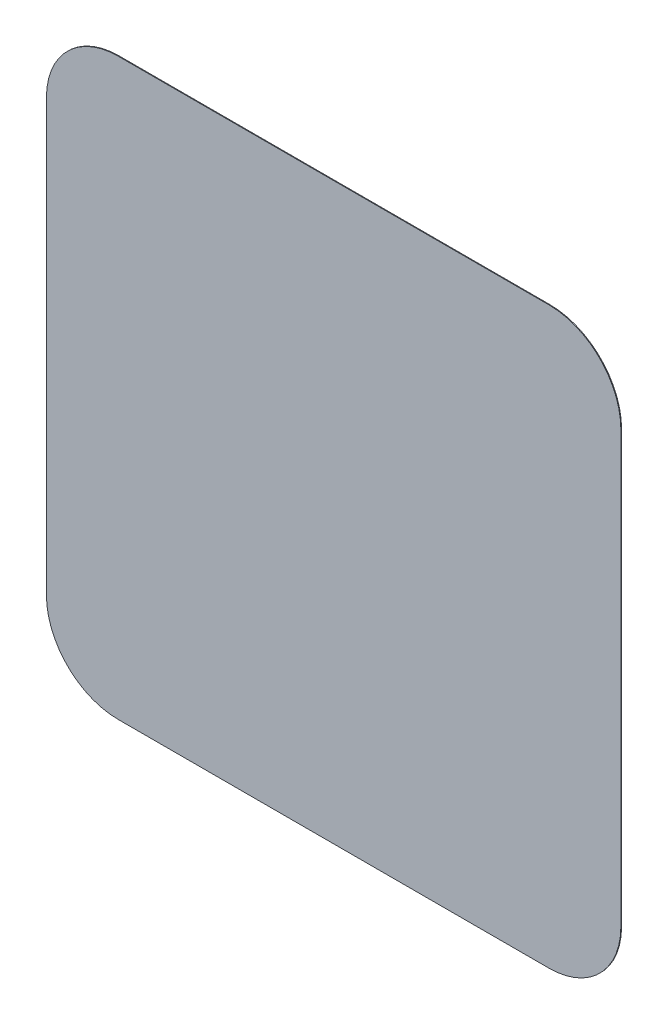
ISO-10303-21;
HEADER;
FILE_DESCRIPTION(('STEP AP214'),'2;1');
FILE_NAME('part.step','',(''),(''),'','','');
FILE_SCHEMA(('AUTOMOTIVE_DESIGN { 1 0 10303 214 1 1 1 1 }'));
ENDSEC;
DATA;
#1=APPLICATION_CONTEXT('core data for automotive mechanical design processes');
#2=APPLICATION_PROTOCOL_DEFINITION('international standard','automotive_design',2000,#1);
#3=PRODUCT_CONTEXT('',#1,'mechanical');
#4=PRODUCT('Part','Part','',(#3));
#5=PRODUCT_RELATED_PRODUCT_CATEGORY('part','',(#4));
#6=PRODUCT_DEFINITION_FORMATION('','',#4);
#7=PRODUCT_DEFINITION_CONTEXT('part definition',#1,'design');
#8=PRODUCT_DEFINITION('design','',#6,#7);
#9=PRODUCT_DEFINITION_SHAPE('','',#8);
#10=(LENGTH_UNIT() NAMED_UNIT(*) SI_UNIT(.MILLI.,.METRE.));
#11=(NAMED_UNIT(*) PLANE_ANGLE_UNIT() SI_UNIT($,.RADIAN.));
#12=(NAMED_UNIT(*) SI_UNIT($,.STERADIAN.) SOLID_ANGLE_UNIT());
#13=UNCERTAINTY_MEASURE_WITH_UNIT(LENGTH_MEASURE(1.E-05),#10,'distance_accuracy_value','');
#14=(GEOMETRIC_REPRESENTATION_CONTEXT(3) GLOBAL_UNCERTAINTY_ASSIGNED_CONTEXT((#13)) GLOBAL_UNIT_ASSIGNED_CONTEXT((#10,
#11,#12)) REPRESENTATION_CONTEXT('',''));
#15=CARTESIAN_POINT('',(0.,0.,0.));
#16=DIRECTION('',(0.,0.,1.));
#17=DIRECTION('',(1.,0.,0.));
#18=AXIS2_PLACEMENT_3D('',#15,#16,#17);
#19=CARTESIAN_POINT('',(-4.,-4.,0.01));
#20=DIRECTION('',(1.,0.,0.));
#21=DIRECTION('',(0.,0.,-1.));
#22=AXIS2_PLACEMENT_3D('',#19,#20,#21);
#23=PLANE('',#22);
#24=DIRECTION('',(0.,-1.,0.));
#25=VECTOR('',#24,1.);
#26=CARTESIAN_POINT('',(-4.,-4.,0.01));
#27=LINE('',#26,#25);
#28=CARTESIAN_POINT('',(-4.,3.,0.01));
#29=VERTEX_POINT('',#28);
#30=CARTESIAN_POINT('',(-4.,-3.,0.01));
#31=VERTEX_POINT('',#30);
#32=EDGE_CURVE('E127',#29,#31,#27,.T.);
#33=ORIENTED_EDGE('',*,*,#32,.F.);
#34=DIRECTION('',(0.,0.,-1.));
#35=VECTOR('',#34,1.);
#36=CARTESIAN_POINT('',(-4.,3.,0.01));
#37=LINE('',#36,#35);
#38=CARTESIAN_POINT('',(-4.,3.,0.));
#39=VERTEX_POINT('',#38);
#40=EDGE_CURVE('E158',#29,#39,#37,.T.);
#41=ORIENTED_EDGE('',*,*,#40,.T.);
#42=DIRECTION('',(0.,-1.,0.));
#43=VECTOR('',#42,1.);
#44=CARTESIAN_POINT('',(-4.,-4.,0.));
#45=LINE('',#44,#43);
#46=CARTESIAN_POINT('',(-4.,-3.,0.));
#47=VERTEX_POINT('',#46);
#48=EDGE_CURVE('E166',#39,#47,#45,.T.);
#49=ORIENTED_EDGE('',*,*,#48,.T.);
#50=DIRECTION('',(0.,0.,-1.));
#51=VECTOR('',#50,1.);
#52=CARTESIAN_POINT('',(-4.,-3.,0.01));
#53=LINE('',#52,#51);
#54=EDGE_CURVE('E156',#47,#31,#53,.F.);
#55=ORIENTED_EDGE('',*,*,#54,.T.);
#56=EDGE_LOOP('',(#33,#41,#49,#55));
#57=FACE_BOUND('',#56,.T.);
#58=ADVANCED_FACE('F37',(#57),#23,.F.);
#59=CARTESIAN_POINT('',(-4.,-4.,0.01));
#60=DIRECTION('',(0.,1.,0.));
#61=DIRECTION('',(0.,0.,1.));
#62=AXIS2_PLACEMENT_3D('',#59,#60,#61);
#63=PLANE('',#62);
#64=DIRECTION('',(1.,0.,0.));
#65=VECTOR('',#64,1.);
#66=CARTESIAN_POINT('',(-4.,-4.,0.));
#67=LINE('',#66,#65);
#68=CARTESIAN_POINT('',(-3.,-4.,0.));
#69=VERTEX_POINT('',#68);
#70=CARTESIAN_POINT('',(3.,-4.,0.));
#71=VERTEX_POINT('',#70);
#72=EDGE_CURVE('E132',#69,#71,#67,.T.);
#73=ORIENTED_EDGE('',*,*,#72,.T.);
#74=DIRECTION('',(0.,0.,-1.));
#75=VECTOR('',#74,1.);
#76=CARTESIAN_POINT('',(3.,-4.,0.01));
#77=LINE('',#76,#75);
#78=CARTESIAN_POINT('',(3.,-4.,0.01));
#79=VERTEX_POINT('',#78);
#80=EDGE_CURVE('E11',#71,#79,#77,.F.);
#81=ORIENTED_EDGE('',*,*,#80,.T.);
#82=DIRECTION('',(1.,0.,0.));
#83=VECTOR('',#82,1.);
#84=CARTESIAN_POINT('',(-4.,-4.,0.01));
#85=LINE('',#84,#83);
#86=CARTESIAN_POINT('',(-3.,-4.,0.01));
#87=VERTEX_POINT('',#86);
#88=EDGE_CURVE('E130',#87,#79,#85,.T.);
#89=ORIENTED_EDGE('',*,*,#88,.F.);
#90=DIRECTION('',(0.,0.,-1.));
#91=VECTOR('',#90,1.);
#92=CARTESIAN_POINT('',(-3.,-4.,0.01));
#93=LINE('',#92,#91);
#94=EDGE_CURVE('E44',#87,#69,#93,.T.);
#95=ORIENTED_EDGE('',*,*,#94,.T.);
#96=EDGE_LOOP('',(#73,#81,#89,#95));
#97=FACE_BOUND('',#96,.T.);
#98=ADVANCED_FACE('F163',(#97),#63,.F.);
#99=CARTESIAN_POINT('',(4.,-4.,0.01));
#100=DIRECTION('',(-1.,0.,0.));
#101=DIRECTION('',(0.,0.,1.));
#102=AXIS2_PLACEMENT_3D('',#99,#100,#101);
#103=PLANE('',#102);
#104=DIRECTION('',(0.,1.,0.));
#105=VECTOR('',#104,1.);
#106=CARTESIAN_POINT('',(4.,-4.,0.));
#107=LINE('',#106,#105);
#108=CARTESIAN_POINT('',(4.,-3.,0.));
#109=VERTEX_POINT('',#108);
#110=CARTESIAN_POINT('',(4.,3.,0.));
#111=VERTEX_POINT('',#110);
#112=EDGE_CURVE('E128',#109,#111,#107,.T.);
#113=ORIENTED_EDGE('',*,*,#112,.T.);
#114=DIRECTION('',(0.,0.,-1.));
#115=VECTOR('',#114,1.);
#116=CARTESIAN_POINT('',(4.,3.,0.01));
#117=LINE('',#116,#115);
#118=CARTESIAN_POINT('',(4.,3.,0.01));
#119=VERTEX_POINT('',#118);
#120=EDGE_CURVE('E106',#111,#119,#117,.F.);
#121=ORIENTED_EDGE('',*,*,#120,.T.);
#122=DIRECTION('',(0.,1.,0.));
#123=VECTOR('',#122,1.);
#124=CARTESIAN_POINT('',(4.,-4.,0.01));
#125=LINE('',#124,#123);
#126=CARTESIAN_POINT('',(4.,-3.,0.01));
#127=VERTEX_POINT('',#126);
#128=EDGE_CURVE('E137',#127,#119,#125,.T.);
#129=ORIENTED_EDGE('',*,*,#128,.F.);
#130=DIRECTION('',(0.,0.,-1.));
#131=VECTOR('',#130,1.);
#132=CARTESIAN_POINT('',(4.,-3.,0.01));
#133=LINE('',#132,#131);
#134=EDGE_CURVE('E111',#127,#109,#133,.T.);
#135=ORIENTED_EDGE('',*,*,#134,.T.);
#136=EDGE_LOOP('',(#113,#121,#129,#135));
#137=FACE_BOUND('',#136,.T.);
#138=ADVANCED_FACE('F186',(#137),#103,.F.);
#139=CARTESIAN_POINT('',(-4.,4.,0.01));
#140=DIRECTION('',(0.,-1.,0.));
#141=DIRECTION('',(0.,0.,-1.));
#142=AXIS2_PLACEMENT_3D('',#139,#140,#141);
#143=PLANE('',#142);
#144=DIRECTION('',(-1.,0.,0.));
#145=VECTOR('',#144,1.);
#146=CARTESIAN_POINT('',(-4.,4.,0.01));
#147=LINE('',#146,#145);
#148=CARTESIAN_POINT('',(3.,4.,0.01));
#149=VERTEX_POINT('',#148);
#150=CARTESIAN_POINT('',(-3.,4.,0.01));
#151=VERTEX_POINT('',#150);
#152=EDGE_CURVE('E121',#149,#151,#147,.T.);
#153=ORIENTED_EDGE('',*,*,#152,.F.);
#154=DIRECTION('',(0.,0.,-1.));
#155=VECTOR('',#154,1.);
#156=CARTESIAN_POINT('',(3.,4.,0.01));
#157=LINE('',#156,#155);
#158=CARTESIAN_POINT('',(3.,4.,0.));
#159=VERTEX_POINT('',#158);
#160=EDGE_CURVE('E105',#149,#159,#157,.T.);
#161=ORIENTED_EDGE('',*,*,#160,.T.);
#162=DIRECTION('',(-1.,0.,0.));
#163=VECTOR('',#162,1.);
#164=CARTESIAN_POINT('',(-4.,4.,0.));
#165=LINE('',#164,#163);
#166=CARTESIAN_POINT('',(-3.,4.,0.));
#167=VERTEX_POINT('',#166);
#168=EDGE_CURVE('E118',#159,#167,#165,.T.);
#169=ORIENTED_EDGE('',*,*,#168,.T.);
#170=DIRECTION('',(0.,0.,-1.));
#171=VECTOR('',#170,1.);
#172=CARTESIAN_POINT('',(-3.,4.,0.01));
#173=LINE('',#172,#171);
#174=EDGE_CURVE('E123',#167,#151,#173,.F.);
#175=ORIENTED_EDGE('',*,*,#174,.T.);
#176=EDGE_LOOP('',(#153,#161,#169,#175));
#177=FACE_BOUND('',#176,.T.);
#178=ADVANCED_FACE('F117',(#177),#143,.F.);
#179=CARTESIAN_POINT('',(-4.,4.,0.01));
#180=DIRECTION('',(0.,0.,-1.));
#181=DIRECTION('',(-1.,0.,0.));
#182=AXIS2_PLACEMENT_3D('',#179,#180,#181);
#183=PLANE('',#182);
#184=ORIENTED_EDGE('',*,*,#128,.T.);
#185=CARTESIAN_POINT('',(3.,3.,0.01));
#186=DIRECTION('',(0.,0.,-1.));
#187=DIRECTION('',(-1.,0.,0.));
#188=AXIS2_PLACEMENT_3D('',#185,#186,#187);
#189=CIRCLE('',#188,1.);
#190=EDGE_CURVE('E154',#119,#149,#189,.F.);
#191=ORIENTED_EDGE('',*,*,#190,.T.);
#192=ORIENTED_EDGE('',*,*,#152,.T.);
#193=CARTESIAN_POINT('',(-3.,3.,0.01));
#194=DIRECTION('',(0.,0.,-1.));
#195=DIRECTION('',(-1.,0.,0.));
#196=AXIS2_PLACEMENT_3D('',#193,#194,#195);
#197=CIRCLE('',#196,1.);
#198=EDGE_CURVE('E152',#151,#29,#197,.F.);
#199=ORIENTED_EDGE('',*,*,#198,.T.);
#200=ORIENTED_EDGE('',*,*,#32,.T.);
#201=CARTESIAN_POINT('',(-3.,-3.,0.01));
#202=DIRECTION('',(0.,0.,-1.));
#203=DIRECTION('',(-1.,0.,0.));
#204=AXIS2_PLACEMENT_3D('',#201,#202,#203);
#205=CIRCLE('',#204,1.);
#206=EDGE_CURVE('E56',#31,#87,#205,.F.);
#207=ORIENTED_EDGE('',*,*,#206,.T.);
#208=ORIENTED_EDGE('',*,*,#88,.T.);
#209=CARTESIAN_POINT('',(3.,-3.,0.01));
#210=DIRECTION('',(0.,0.,-1.));
#211=DIRECTION('',(-1.,0.,0.));
#212=AXIS2_PLACEMENT_3D('',#209,#210,#211);
#213=CIRCLE('',#212,1.);
#214=EDGE_CURVE('E150',#79,#127,#213,.F.);
#215=ORIENTED_EDGE('',*,*,#214,.T.);
#216=EDGE_LOOP('',(#184,#191,#192,#199,#200,#207,#208,#215));
#217=FACE_BOUND('',#216,.T.);
#218=ADVANCED_FACE('F195',(#217),#183,.F.);
#219=CARTESIAN_POINT('',(-4.,4.,0.));
#220=DIRECTION('',(0.,0.,-1.));
#221=DIRECTION('',(-1.,0.,0.));
#222=AXIS2_PLACEMENT_3D('',#219,#220,#221);
#223=PLANE('',#222);
#224=ORIENTED_EDGE('',*,*,#168,.F.);
#225=CARTESIAN_POINT('',(3.,3.,0.));
#226=DIRECTION('',(0.,0.,-1.));
#227=DIRECTION('',(-1.,0.,0.));
#228=AXIS2_PLACEMENT_3D('',#225,#226,#227);
#229=CIRCLE('',#228,1.);
#230=EDGE_CURVE('E101',#159,#111,#229,.T.);
#231=ORIENTED_EDGE('',*,*,#230,.T.);
#232=ORIENTED_EDGE('',*,*,#112,.F.);
#233=CARTESIAN_POINT('',(3.,-3.,0.));
#234=DIRECTION('',(0.,0.,-1.));
#235=DIRECTION('',(-1.,0.,0.));
#236=AXIS2_PLACEMENT_3D('',#233,#234,#235);
#237=CIRCLE('',#236,1.);
#238=EDGE_CURVE('E143',#109,#71,#237,.T.);
#239=ORIENTED_EDGE('',*,*,#238,.T.);
#240=ORIENTED_EDGE('',*,*,#72,.F.);
#241=CARTESIAN_POINT('',(-3.,-3.,0.));
#242=DIRECTION('',(0.,0.,-1.));
#243=DIRECTION('',(-1.,0.,0.));
#244=AXIS2_PLACEMENT_3D('',#241,#242,#243);
#245=CIRCLE('',#244,1.);
#246=EDGE_CURVE('E122',#69,#47,#245,.T.);
#247=ORIENTED_EDGE('',*,*,#246,.T.);
#248=ORIENTED_EDGE('',*,*,#48,.F.);
#249=CARTESIAN_POINT('',(-3.,3.,0.));
#250=DIRECTION('',(0.,0.,-1.));
#251=DIRECTION('',(-1.,0.,0.));
#252=AXIS2_PLACEMENT_3D('',#249,#250,#251);
#253=CIRCLE('',#252,1.);
#254=EDGE_CURVE('E112',#39,#167,#253,.T.);
#255=ORIENTED_EDGE('',*,*,#254,.T.);
#256=EDGE_LOOP('',(#224,#231,#232,#239,#240,#247,#248,#255));
#257=FACE_BOUND('',#256,.T.);
#258=ADVANCED_FACE('F125',(#257),#223,.T.);
#259=CARTESIAN_POINT('',(3.,3.,0.01));
#260=DIRECTION('',(0.,0.,-1.));
#261=DIRECTION('',(-1.,0.,0.));
#262=AXIS2_PLACEMENT_3D('',#259,#260,#261);
#263=CYLINDRICAL_SURFACE('',#262,1.);
#264=ORIENTED_EDGE('',*,*,#190,.F.);
#265=ORIENTED_EDGE('',*,*,#120,.F.);
#266=ORIENTED_EDGE('',*,*,#230,.F.);
#267=ORIENTED_EDGE('',*,*,#160,.F.);
#268=EDGE_LOOP('',(#264,#265,#266,#267));
#269=FACE_BOUND('',#268,.T.);
#270=ADVANCED_FACE('F104',(#269),#263,.T.);
#271=CARTESIAN_POINT('',(-3.,3.,0.01));
#272=DIRECTION('',(0.,0.,-1.));
#273=DIRECTION('',(-1.,0.,0.));
#274=AXIS2_PLACEMENT_3D('',#271,#272,#273);
#275=CYLINDRICAL_SURFACE('',#274,1.);
#276=ORIENTED_EDGE('',*,*,#198,.F.);
#277=ORIENTED_EDGE('',*,*,#174,.F.);
#278=ORIENTED_EDGE('',*,*,#254,.F.);
#279=ORIENTED_EDGE('',*,*,#40,.F.);
#280=EDGE_LOOP('',(#276,#277,#278,#279));
#281=FACE_BOUND('',#280,.T.);
#282=ADVANCED_FACE('F179',(#281),#275,.T.);
#283=CARTESIAN_POINT('',(3.,-3.,0.01));
#284=DIRECTION('',(0.,0.,-1.));
#285=DIRECTION('',(-1.,0.,0.));
#286=AXIS2_PLACEMENT_3D('',#283,#284,#285);
#287=CYLINDRICAL_SURFACE('',#286,1.);
#288=ORIENTED_EDGE('',*,*,#214,.F.);
#289=ORIENTED_EDGE('',*,*,#80,.F.);
#290=ORIENTED_EDGE('',*,*,#238,.F.);
#291=ORIENTED_EDGE('',*,*,#134,.F.);
#292=EDGE_LOOP('',(#288,#289,#290,#291));
#293=FACE_BOUND('',#292,.T.);
#294=ADVANCED_FACE('F174',(#293),#287,.T.);
#295=CARTESIAN_POINT('',(-3.,-3.,0.01));
#296=DIRECTION('',(0.,0.,-1.));
#297=DIRECTION('',(-1.,0.,0.));
#298=AXIS2_PLACEMENT_3D('',#295,#296,#297);
#299=CYLINDRICAL_SURFACE('',#298,1.);
#300=ORIENTED_EDGE('',*,*,#206,.F.);
#301=ORIENTED_EDGE('',*,*,#54,.F.);
#302=ORIENTED_EDGE('',*,*,#246,.F.);
#303=ORIENTED_EDGE('',*,*,#94,.F.);
#304=EDGE_LOOP('',(#300,#301,#302,#303));
#305=FACE_BOUND('',#304,.T.);
#306=ADVANCED_FACE('F172',(#305),#299,.T.);
#307=CLOSED_SHELL('',(#58,#98,#138,#178,#218,#258,#270,#282,#294,#306));
#308=MANIFOLD_SOLID_BREP('B2',#307);
#309=ADVANCED_BREP_SHAPE_REPRESENTATION('',(#18,#308),#14);
#310=SHAPE_DEFINITION_REPRESENTATION(#9,#309);
ENDSEC;
END-ISO-10303-21;
